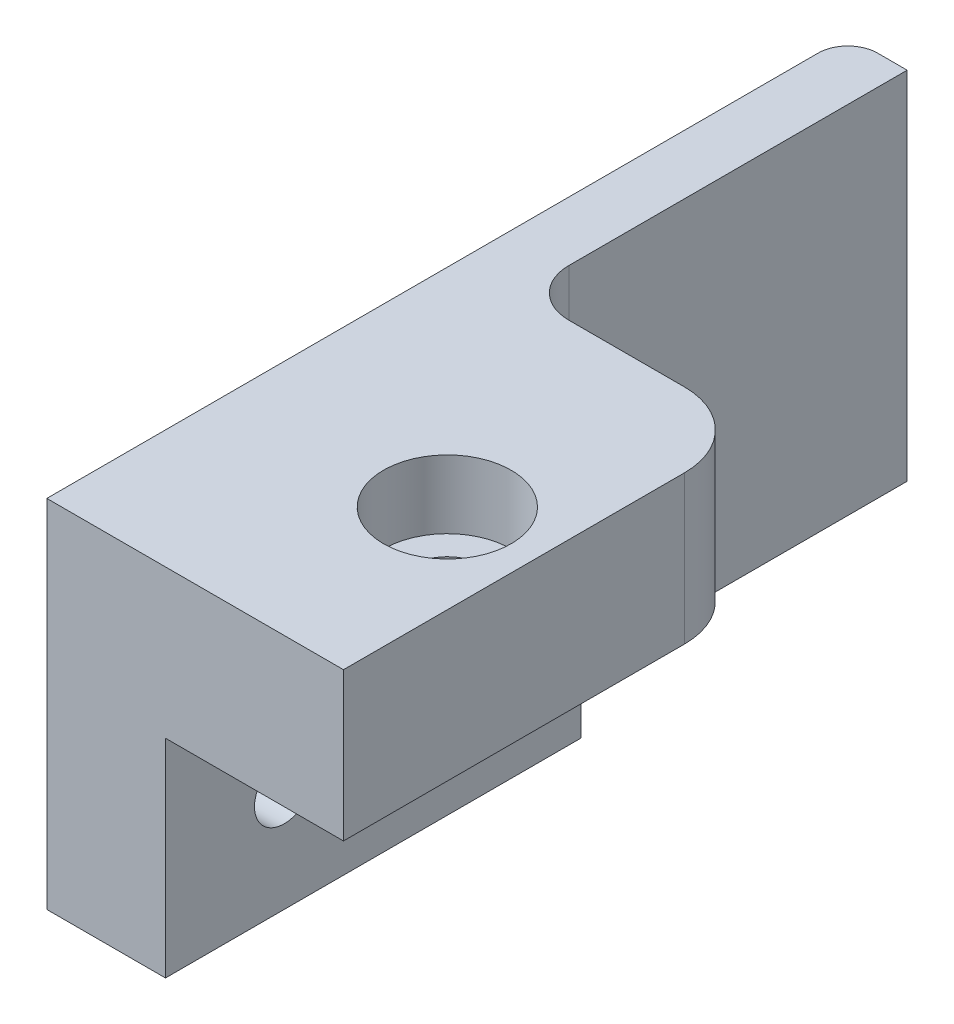
ISO-10303-21;
HEADER;
FILE_DESCRIPTION(('STEP AP214'),'2;1');
FILE_NAME('part.step','',(''),(''),'','','');
FILE_SCHEMA(('AUTOMOTIVE_DESIGN { 1 0 10303 214 1 1 1 1 }'));
ENDSEC;
DATA;
#1=APPLICATION_CONTEXT('core data for automotive mechanical design processes');
#2=APPLICATION_PROTOCOL_DEFINITION('international standard','automotive_design',2000,#1);
#3=PRODUCT_CONTEXT('',#1,'mechanical');
#4=PRODUCT('Part','Part','',(#3));
#5=PRODUCT_RELATED_PRODUCT_CATEGORY('part','',(#4));
#6=PRODUCT_DEFINITION_FORMATION('','',#4);
#7=PRODUCT_DEFINITION_CONTEXT('part definition',#1,'design');
#8=PRODUCT_DEFINITION('design','',#6,#7);
#9=PRODUCT_DEFINITION_SHAPE('','',#8);
#10=(LENGTH_UNIT() NAMED_UNIT(*) SI_UNIT(.MILLI.,.METRE.));
#11=(NAMED_UNIT(*) PLANE_ANGLE_UNIT() SI_UNIT($,.RADIAN.));
#12=(NAMED_UNIT(*) SI_UNIT($,.STERADIAN.) SOLID_ANGLE_UNIT());
#13=UNCERTAINTY_MEASURE_WITH_UNIT(LENGTH_MEASURE(1.E-05),#10,'distance_accuracy_value','');
#14=(GEOMETRIC_REPRESENTATION_CONTEXT(3) GLOBAL_UNCERTAINTY_ASSIGNED_CONTEXT((#13)) GLOBAL_UNIT_ASSIGNED_CONTEXT((#10,
#11,#12)) REPRESENTATION_CONTEXT('',''));
#15=CARTESIAN_POINT('',(0.,0.,0.));
#16=DIRECTION('',(0.,0.,1.));
#17=DIRECTION('',(1.,0.,0.));
#18=AXIS2_PLACEMENT_3D('',#15,#16,#17);
#19=CARTESIAN_POINT('',(10.,12.,-11.5));
#20=DIRECTION('',(-1.,0.,0.));
#21=DIRECTION('',(0.,0.,1.));
#22=AXIS2_PLACEMENT_3D('',#19,#20,#21);
#23=PLANE('',#22);
#24=DIRECTION('',(0.,0.,1.));
#25=VECTOR('',#24,1.);
#26=CARTESIAN_POINT('',(10.,7.,-20.));
#27=LINE('',#26,#25);
#28=CARTESIAN_POINT('',(10.,7.,-11.5));
#29=VERTEX_POINT('',#28);
#30=CARTESIAN_POINT('',(10.,7.,0.));
#31=VERTEX_POINT('',#30);
#32=EDGE_CURVE('E213',#29,#31,#27,.T.);
#33=ORIENTED_EDGE('',*,*,#32,.F.);
#34=DIRECTION('',(0.,-1.,0.));
#35=VECTOR('',#34,1.);
#36=CARTESIAN_POINT('',(10.,12.,-11.5));
#37=LINE('',#36,#35);
#38=CARTESIAN_POINT('',(10.,12.,-11.5));
#39=VERTEX_POINT('',#38);
#40=EDGE_CURVE('E203',#39,#29,#37,.T.);
#41=ORIENTED_EDGE('',*,*,#40,.F.);
#42=DIRECTION('',(0.,0.,-1.));
#43=VECTOR('',#42,1.);
#44=CARTESIAN_POINT('',(10.,12.,-11.5));
#45=LINE('',#44,#43);
#46=CARTESIAN_POINT('',(10.,12.,0.));
#47=VERTEX_POINT('',#46);
#48=EDGE_CURVE('E110',#47,#39,#45,.T.);
#49=ORIENTED_EDGE('',*,*,#48,.F.);
#50=DIRECTION('',(0.,-1.,0.));
#51=VECTOR('',#50,1.);
#52=CARTESIAN_POINT('',(10.,12.,0.));
#53=LINE('',#52,#51);
#54=EDGE_CURVE('E58',#47,#31,#53,.T.);
#55=ORIENTED_EDGE('',*,*,#54,.T.);
#56=EDGE_LOOP('',(#33,#41,#49,#55));
#57=FACE_BOUND('',#56,.T.);
#58=ADVANCED_FACE('F49',(#57),#23,.F.);
#59=CARTESIAN_POINT('',(7.50000000000001,12.,-11.5));
#60=DIRECTION('',(0.,-1.,0.));
#61=DIRECTION('',(0.,0.,-1.));
#62=AXIS2_PLACEMENT_3D('',#59,#60,#61);
#63=CYLINDRICAL_SURFACE('',#62,2.5);
#64=CARTESIAN_POINT('',(7.50000000000001,7.,-11.5));
#65=DIRECTION('',(0.,-1.,0.));
#66=DIRECTION('',(0.,0.,-1.));
#67=AXIS2_PLACEMENT_3D('',#64,#65,#66);
#68=CIRCLE('',#67,2.5);
#69=CARTESIAN_POINT('',(7.49999999999999,7.,-14.));
#70=VERTEX_POINT('',#69);
#71=EDGE_CURVE('E168',#70,#29,#68,.T.);
#72=ORIENTED_EDGE('',*,*,#71,.F.);
#73=DIRECTION('',(0.,-1.,0.));
#74=VECTOR('',#73,1.);
#75=CARTESIAN_POINT('',(7.49999999999999,12.,-14.));
#76=LINE('',#75,#74);
#77=CARTESIAN_POINT('',(7.49999999999999,12.,-14.));
#78=VERTEX_POINT('',#77);
#79=EDGE_CURVE('E199',#78,#70,#76,.T.);
#80=ORIENTED_EDGE('',*,*,#79,.F.);
#81=CARTESIAN_POINT('',(7.50000000000001,12.,-11.5));
#82=DIRECTION('',(0.,1.,0.));
#83=DIRECTION('',(0.,0.,1.));
#84=AXIS2_PLACEMENT_3D('',#81,#82,#83);
#85=CIRCLE('',#84,2.5);
#86=EDGE_CURVE('E251',#39,#78,#85,.T.);
#87=ORIENTED_EDGE('',*,*,#86,.F.);
#88=ORIENTED_EDGE('',*,*,#40,.T.);
#89=EDGE_LOOP('',(#72,#80,#87,#88));
#90=FACE_BOUND('',#89,.T.);
#91=ADVANCED_FACE('F344',(#90),#63,.T.);
#92=CARTESIAN_POINT('',(0.,12.,0.));
#93=DIRECTION('',(0.,0.,-1.));
#94=DIRECTION('',(-1.,0.,0.));
#95=AXIS2_PLACEMENT_3D('',#92,#93,#94);
#96=PLANE('',#95);
#97=DIRECTION('',(1.,0.,0.));
#98=VECTOR('',#97,1.);
#99=CARTESIAN_POINT('',(0.,0.,0.));
#100=LINE('',#99,#98);
#101=CARTESIAN_POINT('',(0.,0.,0.));
#102=VERTEX_POINT('',#101);
#103=CARTESIAN_POINT('',(4.,0.,0.));
#104=VERTEX_POINT('',#103);
#105=EDGE_CURVE('E163',#102,#104,#100,.T.);
#106=ORIENTED_EDGE('',*,*,#105,.T.);
#107=DIRECTION('',(0.,-1.,0.));
#108=VECTOR('',#107,1.);
#109=CARTESIAN_POINT('',(4.,7.,0.));
#110=LINE('',#109,#108);
#111=CARTESIAN_POINT('',(4.,7.,0.));
#112=VERTEX_POINT('',#111);
#113=EDGE_CURVE('E65',#112,#104,#110,.T.);
#114=ORIENTED_EDGE('',*,*,#113,.F.);
#115=DIRECTION('',(-1.,0.,0.));
#116=VECTOR('',#115,1.);
#117=CARTESIAN_POINT('',(4.,7.,0.));
#118=LINE('',#117,#116);
#119=EDGE_CURVE('E220',#31,#112,#118,.T.);
#120=ORIENTED_EDGE('',*,*,#119,.F.);
#121=ORIENTED_EDGE('',*,*,#54,.F.);
#122=DIRECTION('',(1.,0.,0.));
#123=VECTOR('',#122,1.);
#124=CARTESIAN_POINT('',(0.,12.,0.));
#125=LINE('',#124,#123);
#126=CARTESIAN_POINT('',(0.,12.,0.));
#127=VERTEX_POINT('',#126);
#128=EDGE_CURVE('E184',#127,#47,#125,.T.);
#129=ORIENTED_EDGE('',*,*,#128,.F.);
#130=DIRECTION('',(0.,-1.,0.));
#131=VECTOR('',#130,1.);
#132=CARTESIAN_POINT('',(0.,12.,0.));
#133=LINE('',#132,#131);
#134=EDGE_CURVE('E159',#127,#102,#133,.T.);
#135=ORIENTED_EDGE('',*,*,#134,.T.);
#136=EDGE_LOOP('',(#106,#114,#120,#121,#129,#135));
#137=FACE_BOUND('',#136,.T.);
#138=ADVANCED_FACE('F51',(#137),#96,.F.);
#139=CARTESIAN_POINT('',(3.60000000000001,12.,-14.));
#140=DIRECTION('',(0.,0.,1.));
#141=DIRECTION('',(1.,0.,0.));
#142=AXIS2_PLACEMENT_3D('',#139,#140,#141);
#143=PLANE('',#142);
#144=DIRECTION('',(1.,0.,0.));
#145=VECTOR('',#144,1.);
#146=CARTESIAN_POINT('',(3.60000000000001,7.,-14.));
#147=LINE('',#146,#145);
#148=CARTESIAN_POINT('',(4.,7.,-14.));
#149=VERTEX_POINT('',#148);
#150=EDGE_CURVE('E11',#149,#70,#147,.T.);
#151=ORIENTED_EDGE('',*,*,#150,.F.);
#152=DIRECTION('',(0.,-1.,0.));
#153=VECTOR('',#152,1.);
#154=CARTESIAN_POINT('',(4.,12.,-14.));
#155=LINE('',#154,#153);
#156=CARTESIAN_POINT('',(4.,0.,-14.));
#157=VERTEX_POINT('',#156);
#158=EDGE_CURVE('E241',#149,#157,#155,.T.);
#159=ORIENTED_EDGE('',*,*,#158,.T.);
#160=DIRECTION('',(-1.,0.,0.));
#161=VECTOR('',#160,1.);
#162=CARTESIAN_POINT('',(3.60000000000001,0.,-14.));
#163=LINE('',#162,#161);
#164=CARTESIAN_POINT('',(3.60000000000001,0.,-14.));
#165=VERTEX_POINT('',#164);
#166=EDGE_CURVE('E167',#157,#165,#163,.T.);
#167=ORIENTED_EDGE('',*,*,#166,.T.);
#168=DIRECTION('',(0.,-1.,0.));
#169=VECTOR('',#168,1.);
#170=CARTESIAN_POINT('',(3.60000000000001,12.,-14.));
#171=LINE('',#170,#169);
#172=CARTESIAN_POINT('',(3.60000000000001,12.,-14.));
#173=VERTEX_POINT('',#172);
#174=EDGE_CURVE('E195',#173,#165,#171,.T.);
#175=ORIENTED_EDGE('',*,*,#174,.F.);
#176=DIRECTION('',(-1.,0.,0.));
#177=VECTOR('',#176,1.);
#178=CARTESIAN_POINT('',(3.60000000000001,12.,-14.));
#179=LINE('',#178,#177);
#180=EDGE_CURVE('E254',#78,#173,#179,.T.);
#181=ORIENTED_EDGE('',*,*,#180,.F.);
#182=ORIENTED_EDGE('',*,*,#79,.T.);
#183=EDGE_LOOP('',(#151,#159,#167,#175,#181,#182));
#184=FACE_BOUND('',#183,.T.);
#185=ADVANCED_FACE('F350',(#184),#143,.F.);
#186=CARTESIAN_POINT('',(3.6,12.,-15.6));
#187=DIRECTION('',(0.,-1.,0.));
#188=DIRECTION('',(0.,0.,-1.));
#189=AXIS2_PLACEMENT_3D('',#186,#187,#188);
#190=CYLINDRICAL_SURFACE('',#189,1.6);
#191=CARTESIAN_POINT('',(3.6,0.,-15.6));
#192=DIRECTION('',(0.,-1.,0.));
#193=DIRECTION('',(0.,0.,-1.));
#194=AXIS2_PLACEMENT_3D('',#191,#192,#193);
#195=CIRCLE('',#194,1.6);
#196=CARTESIAN_POINT('',(2.,0.,-15.6));
#197=VERTEX_POINT('',#196);
#198=EDGE_CURVE('E171',#165,#197,#195,.T.);
#199=ORIENTED_EDGE('',*,*,#198,.T.);
#200=DIRECTION('',(0.,-1.,0.));
#201=VECTOR('',#200,1.);
#202=CARTESIAN_POINT('',(2.,12.,-15.6));
#203=LINE('',#202,#201);
#204=CARTESIAN_POINT('',(2.,12.,-15.6));
#205=VERTEX_POINT('',#204);
#206=EDGE_CURVE('E191',#205,#197,#203,.T.);
#207=ORIENTED_EDGE('',*,*,#206,.F.);
#208=CARTESIAN_POINT('',(3.6,12.,-15.6));
#209=DIRECTION('',(0.,-1.,0.));
#210=DIRECTION('',(0.,0.,-1.));
#211=AXIS2_PLACEMENT_3D('',#208,#209,#210);
#212=CIRCLE('',#211,1.6);
#213=EDGE_CURVE('E256',#173,#205,#212,.T.);
#214=ORIENTED_EDGE('',*,*,#213,.F.);
#215=ORIENTED_EDGE('',*,*,#174,.T.);
#216=EDGE_LOOP('',(#199,#207,#214,#215));
#217=FACE_BOUND('',#216,.T.);
#218=ADVANCED_FACE('F353',(#217),#190,.F.);
#219=CARTESIAN_POINT('',(2.,12.,-27.));
#220=DIRECTION('',(-1.,0.,0.));
#221=DIRECTION('',(0.,0.,1.));
#222=AXIS2_PLACEMENT_3D('',#219,#220,#221);
#223=PLANE('',#222);
#224=DIRECTION('',(0.,0.,-1.));
#225=VECTOR('',#224,1.);
#226=CARTESIAN_POINT('',(2.,0.,-27.));
#227=LINE('',#226,#225);
#228=CARTESIAN_POINT('',(2.,0.,-27.));
#229=VERTEX_POINT('',#228);
#230=EDGE_CURVE('E174',#197,#229,#227,.T.);
#231=ORIENTED_EDGE('',*,*,#230,.T.);
#232=DIRECTION('',(0.,-1.,0.));
#233=VECTOR('',#232,1.);
#234=CARTESIAN_POINT('',(2.,12.,-27.));
#235=LINE('',#234,#233);
#236=CARTESIAN_POINT('',(2.,12.,-27.));
#237=VERTEX_POINT('',#236);
#238=EDGE_CURVE('E149',#237,#229,#235,.T.);
#239=ORIENTED_EDGE('',*,*,#238,.F.);
#240=DIRECTION('',(0.,0.,-1.));
#241=VECTOR('',#240,1.);
#242=CARTESIAN_POINT('',(2.,12.,-27.));
#243=LINE('',#242,#241);
#244=EDGE_CURVE('E135',#205,#237,#243,.T.);
#245=ORIENTED_EDGE('',*,*,#244,.F.);
#246=ORIENTED_EDGE('',*,*,#206,.T.);
#247=EDGE_LOOP('',(#231,#239,#245,#246));
#248=FACE_BOUND('',#247,.T.);
#249=ADVANCED_FACE('F357',(#248),#223,.F.);
#250=CARTESIAN_POINT('',(1.00000000000001,12.,-27.));
#251=DIRECTION('',(0.,0.,1.));
#252=DIRECTION('',(1.,0.,0.));
#253=AXIS2_PLACEMENT_3D('',#250,#251,#252);
#254=PLANE('',#253);
#255=DIRECTION('',(-1.,0.,0.));
#256=VECTOR('',#255,1.);
#257=CARTESIAN_POINT('',(1.00000000000001,0.,-27.));
#258=LINE('',#257,#256);
#259=CARTESIAN_POINT('',(1.00000000000001,0.,-27.));
#260=VERTEX_POINT('',#259);
#261=EDGE_CURVE('E145',#229,#260,#258,.T.);
#262=ORIENTED_EDGE('',*,*,#261,.T.);
#263=DIRECTION('',(0.,-1.,0.));
#264=VECTOR('',#263,1.);
#265=CARTESIAN_POINT('',(1.00000000000001,12.,-27.));
#266=LINE('',#265,#264);
#267=CARTESIAN_POINT('',(1.00000000000001,12.,-27.));
#268=VERTEX_POINT('',#267);
#269=EDGE_CURVE('E142',#268,#260,#266,.T.);
#270=ORIENTED_EDGE('',*,*,#269,.F.);
#271=DIRECTION('',(-1.,0.,0.));
#272=VECTOR('',#271,1.);
#273=CARTESIAN_POINT('',(1.00000000000001,12.,-27.));
#274=LINE('',#273,#272);
#275=EDGE_CURVE('E128',#237,#268,#274,.T.);
#276=ORIENTED_EDGE('',*,*,#275,.F.);
#277=ORIENTED_EDGE('',*,*,#238,.T.);
#278=EDGE_LOOP('',(#262,#270,#276,#277));
#279=FACE_BOUND('',#278,.T.);
#280=ADVANCED_FACE('F143',(#279),#254,.F.);
#281=CARTESIAN_POINT('',(1.,12.,-26.));
#282=DIRECTION('',(0.,-1.,0.));
#283=DIRECTION('',(0.,0.,-1.));
#284=AXIS2_PLACEMENT_3D('',#281,#282,#283);
#285=CYLINDRICAL_SURFACE('',#284,1.);
#286=CARTESIAN_POINT('',(1.,0.,-26.));
#287=DIRECTION('',(0.,1.,0.));
#288=DIRECTION('',(0.,0.,1.));
#289=AXIS2_PLACEMENT_3D('',#286,#287,#288);
#290=CIRCLE('',#289,1.);
#291=CARTESIAN_POINT('',(0.,0.,-26.));
#292=VERTEX_POINT('',#291);
#293=EDGE_CURVE('E179',#260,#292,#290,.T.);
#294=ORIENTED_EDGE('',*,*,#293,.T.);
#295=DIRECTION('',(0.,-1.,0.));
#296=VECTOR('',#295,1.);
#297=CARTESIAN_POINT('',(0.,12.,-26.));
#298=LINE('',#297,#296);
#299=CARTESIAN_POINT('',(0.,12.,-26.));
#300=VERTEX_POINT('',#299);
#301=EDGE_CURVE('E150',#300,#292,#298,.T.);
#302=ORIENTED_EDGE('',*,*,#301,.F.);
#303=CARTESIAN_POINT('',(1.,12.,-26.));
#304=DIRECTION('',(0.,1.,0.));
#305=DIRECTION('',(0.,0.,1.));
#306=AXIS2_PLACEMENT_3D('',#303,#304,#305);
#307=CIRCLE('',#306,1.);
#308=EDGE_CURVE('E132',#268,#300,#307,.T.);
#309=ORIENTED_EDGE('',*,*,#308,.F.);
#310=ORIENTED_EDGE('',*,*,#269,.T.);
#311=EDGE_LOOP('',(#294,#302,#309,#310));
#312=FACE_BOUND('',#311,.T.);
#313=ADVANCED_FACE('F152',(#312),#285,.T.);
#314=CARTESIAN_POINT('',(0.,12.,-26.));
#315=DIRECTION('',(1.,0.,0.));
#316=DIRECTION('',(0.,0.,-1.));
#317=AXIS2_PLACEMENT_3D('',#314,#315,#316);
#318=PLANE('',#317);
#319=CARTESIAN_POINT('',(0.,3.5,-9.));
#320=DIRECTION('',(-1.,0.,0.));
#321=DIRECTION('',(0.,0.,1.));
#322=AXIS2_PLACEMENT_3D('',#319,#320,#321);
#323=CIRCLE('',#322,0.999999999999999);
#324=CARTESIAN_POINT('',(0.,3.5,-8.));
#325=VERTEX_POINT('',#324);
#326=EDGE_CURVE('E299',#325,#325,#323,.T.);
#327=ORIENTED_EDGE('',*,*,#326,.F.);
#328=EDGE_LOOP('',(#327));
#329=FACE_BOUND('',#328,.T.);
#330=CARTESIAN_POINT('',(0.,3.5,-4.));
#331=DIRECTION('',(-1.,0.,0.));
#332=DIRECTION('',(0.,0.,1.));
#333=AXIS2_PLACEMENT_3D('',#330,#331,#332);
#334=CIRCLE('',#333,0.999999999999999);
#335=CARTESIAN_POINT('',(0.,3.5,-3.));
#336=VERTEX_POINT('',#335);
#337=EDGE_CURVE('E289',#336,#336,#334,.T.);
#338=ORIENTED_EDGE('',*,*,#337,.F.);
#339=EDGE_LOOP('',(#338));
#340=FACE_BOUND('',#339,.T.);
#341=DIRECTION('',(0.,0.,1.));
#342=VECTOR('',#341,1.);
#343=CARTESIAN_POINT('',(0.,0.,-26.));
#344=LINE('',#343,#342);
#345=EDGE_CURVE('E101',#292,#102,#344,.T.);
#346=ORIENTED_EDGE('',*,*,#345,.T.);
#347=ORIENTED_EDGE('',*,*,#134,.F.);
#348=DIRECTION('',(0.,0.,1.));
#349=VECTOR('',#348,1.);
#350=CARTESIAN_POINT('',(0.,12.,-26.));
#351=LINE('',#350,#349);
#352=EDGE_CURVE('E74',#300,#127,#351,.T.);
#353=ORIENTED_EDGE('',*,*,#352,.F.);
#354=ORIENTED_EDGE('',*,*,#301,.T.);
#355=EDGE_LOOP('',(#346,#347,#353,#354));
#356=FACE_BOUND('',#355,.T.);
#357=ADVANCED_FACE('F332',(#329,#340,#356),#318,.F.);
#358=CARTESIAN_POINT('',(7.50000000000001,12.,-11.5));
#359=DIRECTION('',(0.,1.,0.));
#360=DIRECTION('',(0.,0.,1.));
#361=AXIS2_PLACEMENT_3D('',#358,#359,#360);
#362=PLANE('',#361);
#363=CARTESIAN_POINT('',(7.00000000000001,12.,-6.5));
#364=DIRECTION('',(0.,1.,0.));
#365=DIRECTION('',(0.,0.,1.));
#366=AXIS2_PLACEMENT_3D('',#363,#364,#365);
#367=CIRCLE('',#366,2.15);
#368=CARTESIAN_POINT('',(7.00000000000001,12.,-4.35));
#369=VERTEX_POINT('',#368);
#370=EDGE_CURVE('E315',#369,#369,#367,.T.);
#371=ORIENTED_EDGE('',*,*,#370,.F.);
#372=EDGE_LOOP('',(#371));
#373=FACE_BOUND('',#372,.T.);
#374=ORIENTED_EDGE('',*,*,#128,.T.);
#375=ORIENTED_EDGE('',*,*,#48,.T.);
#376=ORIENTED_EDGE('',*,*,#86,.T.);
#377=ORIENTED_EDGE('',*,*,#180,.T.);
#378=ORIENTED_EDGE('',*,*,#213,.T.);
#379=ORIENTED_EDGE('',*,*,#244,.T.);
#380=ORIENTED_EDGE('',*,*,#275,.T.);
#381=ORIENTED_EDGE('',*,*,#308,.T.);
#382=ORIENTED_EDGE('',*,*,#352,.T.);
#383=EDGE_LOOP('',(#374,#375,#376,#377,#378,#379,#380,#381,#382));
#384=FACE_BOUND('',#383,.T.);
#385=ADVANCED_FACE('F130',(#373,#384),#362,.T.);
#386=CARTESIAN_POINT('',(7.50000000000001,0.,-11.5));
#387=DIRECTION('',(0.,1.,0.));
#388=DIRECTION('',(0.,0.,1.));
#389=AXIS2_PLACEMENT_3D('',#386,#387,#388);
#390=PLANE('',#389);
#391=ORIENTED_EDGE('',*,*,#166,.F.);
#392=DIRECTION('',(0.,0.,-1.));
#393=VECTOR('',#392,1.);
#394=CARTESIAN_POINT('',(4.,0.,-20.));
#395=LINE('',#394,#393);
#396=EDGE_CURVE('E232',#104,#157,#395,.T.);
#397=ORIENTED_EDGE('',*,*,#396,.F.);
#398=ORIENTED_EDGE('',*,*,#105,.F.);
#399=ORIENTED_EDGE('',*,*,#345,.F.);
#400=ORIENTED_EDGE('',*,*,#293,.F.);
#401=ORIENTED_EDGE('',*,*,#261,.F.);
#402=ORIENTED_EDGE('',*,*,#230,.F.);
#403=ORIENTED_EDGE('',*,*,#198,.F.);
#404=EDGE_LOOP('',(#391,#397,#398,#399,#400,#401,#402,#403));
#405=FACE_BOUND('',#404,.T.);
#406=ADVANCED_FACE('F331',(#405),#390,.F.);
#407=CARTESIAN_POINT('',(0.,7.,0.));
#408=DIRECTION('',(0.,-1.,0.));
#409=DIRECTION('',(0.,0.,-1.));
#410=AXIS2_PLACEMENT_3D('',#407,#408,#409);
#411=PLANE('',#410);
#412=CARTESIAN_POINT('',(7.00000000000001,7.,-6.5));
#413=DIRECTION('',(0.,-1.,0.));
#414=DIRECTION('',(0.,0.,-1.));
#415=AXIS2_PLACEMENT_3D('',#412,#413,#414);
#416=CIRCLE('',#415,1.2);
#417=CARTESIAN_POINT('',(7.00000000000001,7.,-7.7));
#418=VERTEX_POINT('',#417);
#419=EDGE_CURVE('E280',#418,#418,#416,.T.);
#420=ORIENTED_EDGE('',*,*,#419,.F.);
#421=EDGE_LOOP('',(#420));
#422=FACE_BOUND('',#421,.T.);
#423=ORIENTED_EDGE('',*,*,#71,.T.);
#424=ORIENTED_EDGE('',*,*,#32,.T.);
#425=ORIENTED_EDGE('',*,*,#119,.T.);
#426=DIRECTION('',(0.,0.,-1.));
#427=VECTOR('',#426,1.);
#428=CARTESIAN_POINT('',(4.,7.,-20.));
#429=LINE('',#428,#427);
#430=EDGE_CURVE('E224',#112,#149,#429,.T.);
#431=ORIENTED_EDGE('',*,*,#430,.T.);
#432=ORIENTED_EDGE('',*,*,#150,.T.);
#433=EDGE_LOOP('',(#423,#424,#425,#431,#432));
#434=FACE_BOUND('',#433,.T.);
#435=ADVANCED_FACE('F337',(#422,#434),#411,.T.);
#436=CARTESIAN_POINT('',(4.,7.,-20.));
#437=DIRECTION('',(-1.,0.,0.));
#438=DIRECTION('',(0.,0.,1.));
#439=AXIS2_PLACEMENT_3D('',#436,#437,#438);
#440=PLANE('',#439);
#441=CARTESIAN_POINT('',(4.,3.5,-9.));
#442=DIRECTION('',(-1.,0.,0.));
#443=DIRECTION('',(0.,0.,1.));
#444=AXIS2_PLACEMENT_3D('',#441,#442,#443);
#445=CIRCLE('',#444,0.999999999999999);
#446=CARTESIAN_POINT('',(4.,3.5,-8.));
#447=VERTEX_POINT('',#446);
#448=EDGE_CURVE('E302',#447,#447,#445,.T.);
#449=ORIENTED_EDGE('',*,*,#448,.T.);
#450=EDGE_LOOP('',(#449));
#451=FACE_BOUND('',#450,.T.);
#452=CARTESIAN_POINT('',(4.,3.5,-4.));
#453=DIRECTION('',(-1.,0.,0.));
#454=DIRECTION('',(0.,0.,1.));
#455=AXIS2_PLACEMENT_3D('',#452,#453,#454);
#456=CIRCLE('',#455,0.999999999999999);
#457=CARTESIAN_POINT('',(4.,3.5,-3.));
#458=VERTEX_POINT('',#457);
#459=EDGE_CURVE('E238',#458,#458,#456,.T.);
#460=ORIENTED_EDGE('',*,*,#459,.T.);
#461=EDGE_LOOP('',(#460));
#462=FACE_BOUND('',#461,.T.);
#463=ORIENTED_EDGE('',*,*,#430,.F.);
#464=ORIENTED_EDGE('',*,*,#113,.T.);
#465=ORIENTED_EDGE('',*,*,#396,.T.);
#466=ORIENTED_EDGE('',*,*,#158,.F.);
#467=EDGE_LOOP('',(#463,#464,#465,#466));
#468=FACE_BOUND('',#467,.T.);
#469=ADVANCED_FACE('F381',(#451,#462,#468),#440,.F.);
#470=CARTESIAN_POINT('',(0.,3.5,-4.));
#471=DIRECTION('',(-1.,0.,0.));
#472=DIRECTION('',(0.,0.,1.));
#473=AXIS2_PLACEMENT_3D('',#470,#471,#472);
#474=CYLINDRICAL_SURFACE('',#473,0.999999999999999);
#475=ORIENTED_EDGE('',*,*,#459,.F.);
#476=EDGE_LOOP('',(#475));
#477=FACE_BOUND('',#476,.T.);
#478=ORIENTED_EDGE('',*,*,#337,.T.);
#479=EDGE_LOOP('',(#478));
#480=FACE_BOUND('',#479,.T.);
#481=ADVANCED_FACE('F386',(#477,#480),#474,.F.);
#482=CARTESIAN_POINT('',(0.,3.5,-9.));
#483=DIRECTION('',(-1.,0.,0.));
#484=DIRECTION('',(0.,0.,1.));
#485=AXIS2_PLACEMENT_3D('',#482,#483,#484);
#486=CYLINDRICAL_SURFACE('',#485,0.999999999999999);
#487=ORIENTED_EDGE('',*,*,#448,.F.);
#488=EDGE_LOOP('',(#487));
#489=FACE_BOUND('',#488,.T.);
#490=ORIENTED_EDGE('',*,*,#326,.T.);
#491=EDGE_LOOP('',(#490));
#492=FACE_BOUND('',#491,.T.);
#493=ADVANCED_FACE('F396',(#489,#492),#486,.F.);
#494=CARTESIAN_POINT('',(7.00000000000001,12.,-6.5));
#495=DIRECTION('',(0.,1.,0.));
#496=DIRECTION('',(0.,0.,1.));
#497=AXIS2_PLACEMENT_3D('',#494,#495,#496);
#498=CYLINDRICAL_SURFACE('',#497,1.2);
#499=CARTESIAN_POINT('',(7.00000000000001,9.7,-6.5));
#500=DIRECTION('',(0.,1.,0.));
#501=DIRECTION('',(0.,0.,1.));
#502=AXIS2_PLACEMENT_3D('',#499,#500,#501);
#503=CIRCLE('',#502,1.2);
#504=CARTESIAN_POINT('',(7.00000000000001,9.7,-5.3));
#505=VERTEX_POINT('',#504);
#506=EDGE_CURVE('E277',#505,#505,#503,.T.);
#507=ORIENTED_EDGE('',*,*,#506,.T.);
#508=EDGE_LOOP('',(#507));
#509=FACE_BOUND('',#508,.T.);
#510=ORIENTED_EDGE('',*,*,#419,.T.);
#511=EDGE_LOOP('',(#510));
#512=FACE_BOUND('',#511,.T.);
#513=ADVANCED_FACE('F405',(#509,#512),#498,.F.);
#514=CARTESIAN_POINT('',(8.20000000000001,9.7,-6.5));
#515=DIRECTION('',(0.,-1.,0.));
#516=DIRECTION('',(0.,0.,-1.));
#517=AXIS2_PLACEMENT_3D('',#514,#515,#516);
#518=PLANE('',#517);
#519=ORIENTED_EDGE('',*,*,#506,.F.);
#520=EDGE_LOOP('',(#519));
#521=FACE_BOUND('',#520,.T.);
#522=CARTESIAN_POINT('',(7.00000000000001,9.7,-6.5));
#523=DIRECTION('',(0.,1.,0.));
#524=DIRECTION('',(0.,0.,1.));
#525=AXIS2_PLACEMENT_3D('',#522,#523,#524);
#526=CIRCLE('',#525,2.15);
#527=CARTESIAN_POINT('',(7.00000000000001,9.7,-4.35));
#528=VERTEX_POINT('',#527);
#529=EDGE_CURVE('E262',#528,#528,#526,.T.);
#530=ORIENTED_EDGE('',*,*,#529,.T.);
#531=EDGE_LOOP('',(#530));
#532=FACE_BOUND('',#531,.T.);
#533=ADVANCED_FACE('F428',(#521,#532),#518,.F.);
#534=CARTESIAN_POINT('',(7.00000000000001,12.,-6.5));
#535=DIRECTION('',(0.,1.,0.));
#536=DIRECTION('',(0.,0.,1.));
#537=AXIS2_PLACEMENT_3D('',#534,#535,#536);
#538=CYLINDRICAL_SURFACE('',#537,2.15);
#539=ORIENTED_EDGE('',*,*,#529,.F.);
#540=EDGE_LOOP('',(#539));
#541=FACE_BOUND('',#540,.T.);
#542=ORIENTED_EDGE('',*,*,#370,.T.);
#543=EDGE_LOOP('',(#542));
#544=FACE_BOUND('',#543,.T.);
#545=ADVANCED_FACE('F328',(#541,#544),#538,.F.);
#546=CLOSED_SHELL('',(#58,#91,#138,#185,#218,#249,#280,#313,#357,#385,#406,#435,#469,#481,#493,
#513,#533,#545));
#547=MANIFOLD_SOLID_BREP('B2',#546);
#548=ADVANCED_BREP_SHAPE_REPRESENTATION('',(#18,#547),#14);
#549=SHAPE_DEFINITION_REPRESENTATION(#9,#548);
ENDSEC;
END-ISO-10303-21;
